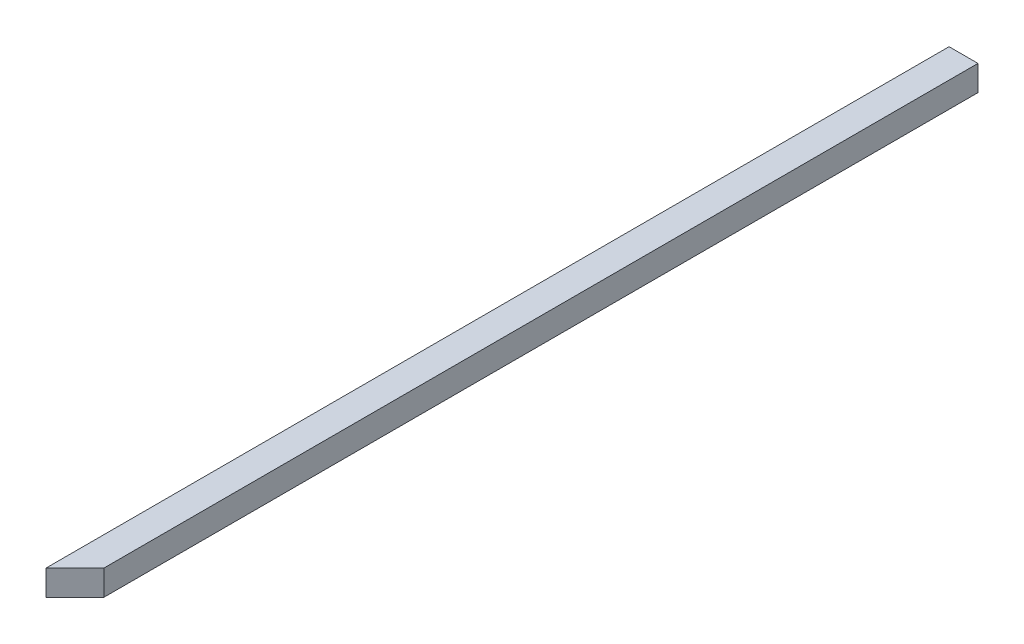
ISO-10303-21;
HEADER;
FILE_DESCRIPTION(('STEP AP214'),'2;1');
FILE_NAME('part.step','',(''),(''),'','','');
FILE_SCHEMA(('AUTOMOTIVE_DESIGN { 1 0 10303 214 1 1 1 1 }'));
ENDSEC;
DATA;
#1=APPLICATION_CONTEXT('core data for automotive mechanical design processes');
#2=APPLICATION_PROTOCOL_DEFINITION('international standard','automotive_design',2000,#1);
#3=PRODUCT_CONTEXT('',#1,'mechanical');
#4=PRODUCT('Part','Part','',(#3));
#5=PRODUCT_RELATED_PRODUCT_CATEGORY('part','',(#4));
#6=PRODUCT_DEFINITION_FORMATION('','',#4);
#7=PRODUCT_DEFINITION_CONTEXT('part definition',#1,'design');
#8=PRODUCT_DEFINITION('design','',#6,#7);
#9=PRODUCT_DEFINITION_SHAPE('','',#8);
#10=(LENGTH_UNIT() NAMED_UNIT(*) SI_UNIT(.MILLI.,.METRE.));
#11=(NAMED_UNIT(*) PLANE_ANGLE_UNIT() SI_UNIT($,.RADIAN.));
#12=(NAMED_UNIT(*) SI_UNIT($,.STERADIAN.) SOLID_ANGLE_UNIT());
#13=UNCERTAINTY_MEASURE_WITH_UNIT(LENGTH_MEASURE(1.E-05),#10,'distance_accuracy_value','');
#14=(GEOMETRIC_REPRESENTATION_CONTEXT(3) GLOBAL_UNCERTAINTY_ASSIGNED_CONTEXT((#13)) GLOBAL_UNIT_ASSIGNED_CONTEXT((#10,
#11,#12)) REPRESENTATION_CONTEXT('',''));
#15=CARTESIAN_POINT('',(0.,0.,0.));
#16=DIRECTION('',(0.,0.,1.));
#17=DIRECTION('',(1.,0.,0.));
#18=AXIS2_PLACEMENT_3D('',#15,#16,#17);
#19=CARTESIAN_POINT('',(173.47767153,-3.5,120.829699469998));
#20=DIRECTION('',(-1.,0.,0.));
#21=DIRECTION('',(0.,0.,1.));
#22=AXIS2_PLACEMENT_3D('',#19,#20,#21);
#23=PLANE('',#22);
#24=DIRECTION('',(0.,1.,0.));
#25=VECTOR('',#24,1.);
#26=CARTESIAN_POINT('',(173.47767153,-3.5,0.));
#27=LINE('',#26,#25);
#28=CARTESIAN_POINT('',(173.47767153,-3.5,0.));
#29=VERTEX_POINT('',#28);
#30=CARTESIAN_POINT('',(173.47767153,0.,0.));
#31=VERTEX_POINT('',#30);
#32=EDGE_CURVE('E88',#29,#31,#27,.T.);
#33=ORIENTED_EDGE('',*,*,#32,.T.);
#34=DIRECTION('',(0.,0.,-1.));
#35=VECTOR('',#34,1.);
#36=CARTESIAN_POINT('',(173.47767153,0.,120.829699469998));
#37=LINE('',#36,#35);
#38=CARTESIAN_POINT('',(173.47767153,0.,120.829699469998));
#39=VERTEX_POINT('',#38);
#40=EDGE_CURVE('E11',#39,#31,#37,.T.);
#41=ORIENTED_EDGE('',*,*,#40,.F.);
#42=DIRECTION('',(0.,1.,0.));
#43=VECTOR('',#42,1.);
#44=CARTESIAN_POINT('',(173.47767153,-3.5,120.829699469998));
#45=LINE('',#44,#43);
#46=CARTESIAN_POINT('',(173.47767153,-3.5,120.829699469998));
#47=VERTEX_POINT('',#46);
#48=EDGE_CURVE('E89',#47,#39,#45,.T.);
#49=ORIENTED_EDGE('',*,*,#48,.F.);
#50=DIRECTION('',(0.,0.,-1.));
#51=VECTOR('',#50,1.);
#52=CARTESIAN_POINT('',(173.47767153,-3.5,120.829699469998));
#53=LINE('',#52,#51);
#54=EDGE_CURVE('E84',#47,#29,#53,.T.);
#55=ORIENTED_EDGE('',*,*,#54,.T.);
#56=EDGE_LOOP('',(#33,#41,#49,#55));
#57=FACE_BOUND('',#56,.T.);
#58=ADVANCED_FACE('F33',(#57),#23,.F.);
#59=CARTESIAN_POINT('',(173.47767153,0.,120.829699469998));
#60=DIRECTION('',(0.,-1.,0.));
#61=DIRECTION('',(0.,0.,-1.));
#62=AXIS2_PLACEMENT_3D('',#59,#60,#61);
#63=PLANE('',#62);
#64=DIRECTION('',(-1.,0.,0.));
#65=VECTOR('',#64,1.);
#66=CARTESIAN_POINT('',(173.47767153,0.,0.));
#67=LINE('',#66,#65);
#68=CARTESIAN_POINT('',(169.47767153,0.,0.));
#69=VERTEX_POINT('',#68);
#70=EDGE_CURVE('E75',#31,#69,#67,.T.);
#71=ORIENTED_EDGE('',*,*,#70,.T.);
#72=DIRECTION('',(0.,0.,-1.));
#73=VECTOR('',#72,1.);
#74=CARTESIAN_POINT('',(169.47767153,0.,120.829699469998));
#75=LINE('',#74,#73);
#76=CARTESIAN_POINT('',(169.477671530002,0.,124.829699469998));
#77=VERTEX_POINT('',#76);
#78=EDGE_CURVE('E41',#77,#69,#75,.T.);
#79=ORIENTED_EDGE('',*,*,#78,.F.);
#80=DIRECTION('',(-0.707106781186398,0.,0.707106781186697));
#81=VECTOR('',#80,1.);
#82=CARTESIAN_POINT('',(169.477671530002,0.,124.829699469998));
#83=LINE('',#82,#81);
#84=EDGE_CURVE('E100',#39,#77,#83,.T.);
#85=ORIENTED_EDGE('',*,*,#84,.F.);
#86=ORIENTED_EDGE('',*,*,#40,.T.);
#87=EDGE_LOOP('',(#71,#79,#85,#86));
#88=FACE_BOUND('',#87,.T.);
#89=ADVANCED_FACE('F106',(#88),#63,.F.);
#90=CARTESIAN_POINT('',(169.47767153,-3.5,120.829699469998));
#91=DIRECTION('',(1.,0.,0.));
#92=DIRECTION('',(0.,0.,-1.));
#93=AXIS2_PLACEMENT_3D('',#90,#91,#92);
#94=PLANE('',#93);
#95=DIRECTION('',(0.,-1.,0.));
#96=VECTOR('',#95,1.);
#97=CARTESIAN_POINT('',(169.47767153,-3.5,0.));
#98=LINE('',#97,#96);
#99=CARTESIAN_POINT('',(169.47767153,-3.5,0.));
#100=VERTEX_POINT('',#99);
#101=EDGE_CURVE('E65',#69,#100,#98,.T.);
#102=ORIENTED_EDGE('',*,*,#101,.T.);
#103=DIRECTION('',(0.,0.,-1.));
#104=VECTOR('',#103,1.);
#105=CARTESIAN_POINT('',(169.47767153,-3.5,120.829699469998));
#106=LINE('',#105,#104);
#107=CARTESIAN_POINT('',(169.477671530002,-3.5,124.829699469998));
#108=VERTEX_POINT('',#107);
#109=EDGE_CURVE('E69',#108,#100,#106,.T.);
#110=ORIENTED_EDGE('',*,*,#109,.F.);
#111=DIRECTION('',(0.,-1.,0.));
#112=VECTOR('',#111,1.);
#113=CARTESIAN_POINT('',(169.477671530002,0.,124.829699469998));
#114=LINE('',#113,#112);
#115=EDGE_CURVE('E99',#77,#108,#114,.T.);
#116=ORIENTED_EDGE('',*,*,#115,.F.);
#117=ORIENTED_EDGE('',*,*,#78,.T.);
#118=EDGE_LOOP('',(#102,#110,#116,#117));
#119=FACE_BOUND('',#118,.T.);
#120=ADVANCED_FACE('F67',(#119),#94,.F.);
#121=CARTESIAN_POINT('',(173.47767153,-3.5,120.829699469998));
#122=DIRECTION('',(0.,1.,0.));
#123=DIRECTION('',(0.,0.,1.));
#124=AXIS2_PLACEMENT_3D('',#121,#122,#123);
#125=PLANE('',#124);
#126=DIRECTION('',(1.,0.,0.));
#127=VECTOR('',#126,1.);
#128=CARTESIAN_POINT('',(173.47767153,-3.5,0.));
#129=LINE('',#128,#127);
#130=EDGE_CURVE('E74',#100,#29,#129,.T.);
#131=ORIENTED_EDGE('',*,*,#130,.T.);
#132=ORIENTED_EDGE('',*,*,#54,.F.);
#133=DIRECTION('',(-0.707106781186398,0.,0.707106781186697));
#134=VECTOR('',#133,1.);
#135=CARTESIAN_POINT('',(169.477671530002,-3.5,124.829699469998));
#136=LINE('',#135,#134);
#137=EDGE_CURVE('E83',#47,#108,#136,.T.);
#138=ORIENTED_EDGE('',*,*,#137,.T.);
#139=ORIENTED_EDGE('',*,*,#109,.T.);
#140=EDGE_LOOP('',(#131,#132,#138,#139));
#141=FACE_BOUND('',#140,.T.);
#142=ADVANCED_FACE('F79',(#141),#125,.F.);
#143=CARTESIAN_POINT('',(0.,0.,0.));
#144=DIRECTION('',(0.,0.,1.));
#145=DIRECTION('',(1.,0.,0.));
#146=AXIS2_PLACEMENT_3D('',#143,#144,#145);
#147=PLANE('',#146);
#148=ORIENTED_EDGE('',*,*,#32,.F.);
#149=ORIENTED_EDGE('',*,*,#130,.F.);
#150=ORIENTED_EDGE('',*,*,#101,.F.);
#151=ORIENTED_EDGE('',*,*,#70,.F.);
#152=EDGE_LOOP('',(#148,#149,#150,#151));
#153=FACE_BOUND('',#152,.T.);
#154=ADVANCED_FACE('F87',(#153),#147,.F.);
#155=CARTESIAN_POINT('',(169.477671530002,0.,124.829699469998));
#156=DIRECTION('',(0.707106781186697,0.,0.707106781186398));
#157=DIRECTION('',(0.707106781186398,0.,-0.707106781186697));
#158=AXIS2_PLACEMENT_3D('',#155,#156,#157);
#159=PLANE('',#158);
#160=ORIENTED_EDGE('',*,*,#137,.F.);
#161=ORIENTED_EDGE('',*,*,#48,.T.);
#162=ORIENTED_EDGE('',*,*,#84,.T.);
#163=ORIENTED_EDGE('',*,*,#115,.T.);
#164=EDGE_LOOP('',(#160,#161,#162,#163));
#165=FACE_BOUND('',#164,.T.);
#166=ADVANCED_FACE('F96',(#165),#159,.T.);
#167=CLOSED_SHELL('',(#58,#89,#120,#142,#154,#166));
#168=MANIFOLD_SOLID_BREP('B2',#167);
#169=ADVANCED_BREP_SHAPE_REPRESENTATION('',(#18,#168),#14);
#170=SHAPE_DEFINITION_REPRESENTATION(#9,#169);
ENDSEC;
END-ISO-10303-21;
